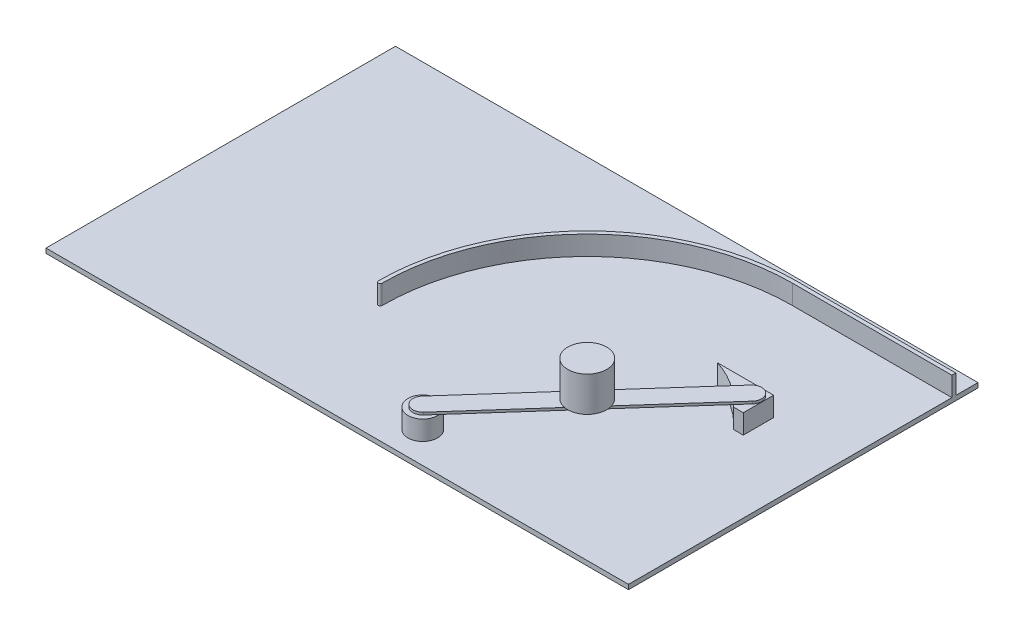
ISO-10303-21;
HEADER;
FILE_DESCRIPTION(('STEP AP214'),'2;1');
FILE_NAME('part.step','',(''),(''),'','','');
FILE_SCHEMA(('AUTOMOTIVE_DESIGN { 1 0 10303 214 1 1 1 1 }'));
ENDSEC;
DATA;
#1=APPLICATION_CONTEXT('core data for automotive mechanical design processes');
#2=APPLICATION_PROTOCOL_DEFINITION('international standard','automotive_design',2000,#1);
#3=PRODUCT_CONTEXT('',#1,'mechanical');
#4=PRODUCT('Part','Part','',(#3));
#5=PRODUCT_RELATED_PRODUCT_CATEGORY('part','',(#4));
#6=PRODUCT_DEFINITION_FORMATION('','',#4);
#7=PRODUCT_DEFINITION_CONTEXT('part definition',#1,'design');
#8=PRODUCT_DEFINITION('design','',#6,#7);
#9=PRODUCT_DEFINITION_SHAPE('','',#8);
#10=(LENGTH_UNIT() NAMED_UNIT(*) SI_UNIT(.MILLI.,.METRE.));
#11=(NAMED_UNIT(*) PLANE_ANGLE_UNIT() SI_UNIT($,.RADIAN.));
#12=(NAMED_UNIT(*) SI_UNIT($,.STERADIAN.) SOLID_ANGLE_UNIT());
#13=UNCERTAINTY_MEASURE_WITH_UNIT(LENGTH_MEASURE(1.E-05),#10,'distance_accuracy_value','');
#14=(GEOMETRIC_REPRESENTATION_CONTEXT(3) GLOBAL_UNCERTAINTY_ASSIGNED_CONTEXT((#13)) GLOBAL_UNIT_ASSIGNED_CONTEXT((#10,
#11,#12)) REPRESENTATION_CONTEXT('',''));
#15=CARTESIAN_POINT('',(0.,0.,0.));
#16=DIRECTION('',(0.,0.,1.));
#17=DIRECTION('',(1.,0.,0.));
#18=AXIS2_PLACEMENT_3D('',#15,#16,#17);
#19=CARTESIAN_POINT('',(139.585526399238,68.35,369.329131793552));
#20=DIRECTION('',(0.,1.,0.));
#21=DIRECTION('',(0.,0.,1.));
#22=AXIS2_PLACEMENT_3D('',#19,#20,#21);
#23=PLANE('',#22);
#24=CARTESIAN_POINT('',(339.,68.35,145.2));
#25=DIRECTION('',(0.,1.,0.));
#26=DIRECTION('',(0.,0.,1.));
#27=AXIS2_PLACEMENT_3D('',#24,#25,#26);
#28=CIRCLE('',#27,50.);
#29=CARTESIAN_POINT('',(386.604110901907,68.35,129.907890098521));
#30=VERTEX_POINT('',#29);
#31=CARTESIAN_POINT('',(348.651577918199,68.35,96.140372568792));
#32=VERTEX_POINT('',#31);
#33=EDGE_CURVE('E48',#30,#32,#28,.T.);
#34=ORIENTED_EDGE('',*,*,#33,.F.);
#35=DIRECTION('',(0.664714912002537,0.,-0.747097105978506));
#36=VECTOR('',#35,1.);
#37=CARTESIAN_POINT('',(158.561792891093,68.35,386.212890558416));
#38=LINE('',#37,#36);
#39=CARTESIAN_POINT('',(557.390740092615,68.35,-62.0453730286874));
#40=VERTEX_POINT('',#39);
#41=EDGE_CURVE('E198',#30,#40,#38,.T.);
#42=ORIENTED_EDGE('',*,*,#41,.T.);
#43=CARTESIAN_POINT('',(538.414473600761,68.35,-78.9291317935519));
#44=DIRECTION('',(0.,1.,0.));
#45=DIRECTION('',(0.,0.,1.));
#46=AXIS2_PLACEMENT_3D('',#43,#44,#45);
#47=CIRCLE('',#46,25.4);
#48=CARTESIAN_POINT('',(519.438207108907,68.35,-95.8128905584162));
#49=VERTEX_POINT('',#48);
#50=EDGE_CURVE('E195',#40,#49,#47,.T.);
#51=ORIENTED_EDGE('',*,*,#50,.T.);
#52=DIRECTION('',(-0.664714912002537,0.,0.747097105978506));
#53=VECTOR('',#52,1.);
#54=CARTESIAN_POINT('',(120.609259907385,68.35,352.445373028687));
#55=LINE('',#54,#53);
#56=EDGE_CURVE('E230',#49,#32,#55,.T.);
#57=ORIENTED_EDGE('',*,*,#56,.T.);
#58=EDGE_LOOP('',(#34,#42,#51,#57));
#59=FACE_BOUND('',#58,.T.);
#60=ADVANCED_FACE('F37',(#59),#23,.T.);
#61=CARTESIAN_POINT('',(339.,62.,145.2));
#62=DIRECTION('',(0.,-1.,0.));
#63=DIRECTION('',(0.,0.,-1.));
#64=AXIS2_PLACEMENT_3D('',#61,#62,#63);
#65=PLANE('',#64);
#66=DIRECTION('',(-0.664714912002537,0.,0.747097105978506));
#67=VECTOR('',#66,1.);
#68=CARTESIAN_POINT('',(120.609259907385,62.,352.445373028687));
#69=LINE('',#68,#67);
#70=CARTESIAN_POINT('',(519.438207108907,62.,-95.8128905584162));
#71=VERTEX_POINT('',#70);
#72=CARTESIAN_POINT('',(496.497380608194,62.,-70.0288667942978));
#73=VERTEX_POINT('',#72);
#74=EDGE_CURVE('E226',#71,#73,#69,.T.);
#75=ORIENTED_EDGE('',*,*,#74,.F.);
#76=CARTESIAN_POINT('',(538.414473600761,62.,-78.9291317935519));
#77=DIRECTION('',(0.,1.,0.));
#78=DIRECTION('',(0.,0.,1.));
#79=AXIS2_PLACEMENT_3D('',#76,#77,#78);
#80=CIRCLE('',#79,25.4);
#81=CARTESIAN_POINT('',(557.390740092615,62.,-62.0453730286874));
#82=VERTEX_POINT('',#81);
#83=EDGE_CURVE('E238',#82,#71,#80,.T.);
#84=ORIENTED_EDGE('',*,*,#83,.F.);
#85=DIRECTION('',(0.664714912002537,0.,-0.747097105978506));
#86=VECTOR('',#85,1.);
#87=CARTESIAN_POINT('',(158.561792891093,62.,386.212890558416));
#88=LINE('',#87,#86);
#89=CARTESIAN_POINT('',(534.449913591902,62.,-36.261349264569));
#90=VERTEX_POINT('',#89);
#91=EDGE_CURVE('E46',#90,#82,#88,.T.);
#92=ORIENTED_EDGE('',*,*,#91,.F.);
#93=CARTESIAN_POINT('',(339.,62.,145.2));
#94=DIRECTION('',(0.,-1.,0.));
#95=DIRECTION('',(0.,0.,-1.));
#96=AXIS2_PLACEMENT_3D('',#93,#94,#95);
#97=CIRCLE('',#96,266.7);
#98=CARTESIAN_POINT('',(539.591489322543,62.,-30.5610434975967));
#99=VERTEX_POINT('',#98);
#100=EDGE_CURVE('E261',#90,#99,#97,.T.);
#101=ORIENTED_EDGE('',*,*,#100,.T.);
#102=DIRECTION('',(1.,0.,0.));
#103=VECTOR('',#102,1.);
#104=CARTESIAN_POINT('',(564.991489322543,62.,-30.5610434975967));
#105=LINE('',#104,#103);
#106=CARTESIAN_POINT('',(564.991489322543,62.,-30.5610434975967));
#107=VERTEX_POINT('',#106);
#108=EDGE_CURVE('E259',#99,#107,#105,.T.);
#109=ORIENTED_EDGE('',*,*,#108,.T.);
#110=DIRECTION('',(0.,0.,-1.));
#111=VECTOR('',#110,1.);
#112=CARTESIAN_POINT('',(564.991489322543,62.,-108.8));
#113=LINE('',#112,#111);
#114=CARTESIAN_POINT('',(564.991489322543,62.,-108.8));
#115=VERTEX_POINT('',#114);
#116=EDGE_CURVE('E263',#107,#115,#113,.T.);
#117=ORIENTED_EDGE('',*,*,#116,.T.);
#118=DIRECTION('',(-1.,0.,0.));
#119=VECTOR('',#118,1.);
#120=CARTESIAN_POINT('',(564.991489322543,62.,-108.8));
#121=LINE('',#120,#119);
#122=CARTESIAN_POINT('',(420.319677815397,62.,-108.8));
#123=VERTEX_POINT('',#122);
#124=EDGE_CURVE('E265',#115,#123,#121,.T.);
#125=ORIENTED_EDGE('',*,*,#124,.T.);
#126=EDGE_CURVE('E256',#123,#73,#97,.T.);
#127=ORIENTED_EDGE('',*,*,#126,.T.);
#128=EDGE_LOOP('',(#75,#84,#92,#101,#109,#117,#125,#127));
#129=FACE_BOUND('',#128,.T.);
#130=ADVANCED_FACE('F370',(#129),#65,.F.);
#131=CARTESIAN_POINT('',(0.,12.,0.));
#132=DIRECTION('',(0.,1.,0.));
#133=DIRECTION('',(0.,0.,1.));
#134=AXIS2_PLACEMENT_3D('',#131,#132,#133);
#135=PLANE('',#134);
#136=CARTESIAN_POINT('',(139.585526399238,12.,369.329131793552));
#137=DIRECTION('',(0.,1.,0.));
#138=DIRECTION('',(0.,0.,1.));
#139=AXIS2_PLACEMENT_3D('',#136,#137,#138);
#140=CIRCLE('',#139,38.1);
#141=CARTESIAN_POINT('',(139.585526399238,12.,407.429131793552));
#142=VERTEX_POINT('',#141);
#143=EDGE_CURVE('E218',#142,#142,#140,.T.);
#144=ORIENTED_EDGE('',*,*,#143,.F.);
#145=EDGE_LOOP('',(#144));
#146=FACE_BOUND('',#145,.T.);
#147=DIRECTION('',(1.,0.,0.));
#148=VECTOR('',#147,1.);
#149=CARTESIAN_POINT('',(339.,12.,-382.8));
#150=LINE('',#149,#148);
#151=CARTESIAN_POINT('',(339.,12.,-382.8));
#152=VERTEX_POINT('',#151);
#153=CARTESIAN_POINT('',(750.,12.,-382.8));
#154=VERTEX_POINT('',#153);
#155=EDGE_CURVE('E286',#152,#154,#150,.T.);
#156=ORIENTED_EDGE('',*,*,#155,.F.);
#157=CARTESIAN_POINT('',(339.,12.,145.2));
#158=DIRECTION('',(0.,1.,0.));
#159=DIRECTION('',(0.,0.,1.));
#160=AXIS2_PLACEMENT_3D('',#157,#158,#159);
#161=CIRCLE('',#160,528.);
#162=CARTESIAN_POINT('',(-189.,12.,145.2));
#163=VERTEX_POINT('',#162);
#164=EDGE_CURVE('E290',#152,#163,#161,.T.);
#165=ORIENTED_EDGE('',*,*,#164,.T.);
#166=CARTESIAN_POINT('',(-194.,12.,145.2));
#167=DIRECTION('',(0.,-1.,0.));
#168=DIRECTION('',(0.,0.,-1.));
#169=AXIS2_PLACEMENT_3D('',#166,#167,#168);
#170=CIRCLE('',#169,5.);
#171=CARTESIAN_POINT('',(-199.,12.,145.2));
#172=VERTEX_POINT('',#171);
#173=EDGE_CURVE('E313',#163,#172,#170,.T.);
#174=ORIENTED_EDGE('',*,*,#173,.T.);
#175=CARTESIAN_POINT('',(339.,12.,145.2));
#176=DIRECTION('',(0.,1.,0.));
#177=DIRECTION('',(0.,0.,1.));
#178=AXIS2_PLACEMENT_3D('',#175,#176,#177);
#179=CIRCLE('',#178,538.);
#180=CARTESIAN_POINT('',(339.,12.,-392.8));
#181=VERTEX_POINT('',#180);
#182=EDGE_CURVE('E310',#181,#172,#179,.T.);
#183=ORIENTED_EDGE('',*,*,#182,.F.);
#184=DIRECTION('',(1.,0.,0.));
#185=VECTOR('',#184,1.);
#186=CARTESIAN_POINT('',(339.,12.,-392.8));
#187=LINE('',#186,#185);
#188=CARTESIAN_POINT('',(750.,12.,-392.8));
#189=VERTEX_POINT('',#188);
#190=EDGE_CURVE('E307',#181,#189,#187,.T.);
#191=ORIENTED_EDGE('',*,*,#190,.T.);
#192=DIRECTION('',(0.,0.,-1.));
#193=VECTOR('',#192,1.);
#194=CARTESIAN_POINT('',(750.,12.,450.));
#195=LINE('',#194,#193);
#196=CARTESIAN_POINT('',(750.,12.,-450.));
#197=VERTEX_POINT('',#196);
#198=EDGE_CURVE('E336',#189,#197,#195,.T.);
#199=ORIENTED_EDGE('',*,*,#198,.T.);
#200=DIRECTION('',(-1.,0.,0.));
#201=VECTOR('',#200,1.);
#202=CARTESIAN_POINT('',(750.,12.,-450.));
#203=LINE('',#202,#201);
#204=CARTESIAN_POINT('',(-750.,12.,-450.));
#205=VERTEX_POINT('',#204);
#206=EDGE_CURVE('E340',#197,#205,#203,.T.);
#207=ORIENTED_EDGE('',*,*,#206,.T.);
#208=DIRECTION('',(0.,0.,1.));
#209=VECTOR('',#208,1.);
#210=CARTESIAN_POINT('',(-750.,12.,450.));
#211=LINE('',#210,#209);
#212=CARTESIAN_POINT('',(-750.,12.,450.));
#213=VERTEX_POINT('',#212);
#214=EDGE_CURVE('E330',#205,#213,#211,.T.);
#215=ORIENTED_EDGE('',*,*,#214,.T.);
#216=DIRECTION('',(1.,0.,0.));
#217=VECTOR('',#216,1.);
#218=CARTESIAN_POINT('',(750.,12.,450.));
#219=LINE('',#218,#217);
#220=CARTESIAN_POINT('',(750.,12.,450.));
#221=VERTEX_POINT('',#220);
#222=EDGE_CURVE('E333',#213,#221,#219,.T.);
#223=ORIENTED_EDGE('',*,*,#222,.T.);
#224=EDGE_CURVE('E337',#221,#154,#195,.T.);
#225=ORIENTED_EDGE('',*,*,#224,.T.);
#226=EDGE_LOOP('',(#156,#165,#174,#183,#191,#199,#207,#215,#223,#225));
#227=FACE_BOUND('',#226,.T.);
#228=DIRECTION('',(1.,0.,0.));
#229=VECTOR('',#228,1.);
#230=CARTESIAN_POINT('',(564.991489322543,12.,-30.5610434975967));
#231=LINE('',#230,#229);
#232=CARTESIAN_POINT('',(539.591489322543,12.,-30.5610434975967));
#233=VERTEX_POINT('',#232);
#234=CARTESIAN_POINT('',(564.991489322543,12.,-30.5610434975967));
#235=VERTEX_POINT('',#234);
#236=EDGE_CURVE('E270',#233,#235,#231,.T.);
#237=ORIENTED_EDGE('',*,*,#236,.F.);
#238=CARTESIAN_POINT('',(339.,12.,145.2));
#239=DIRECTION('',(0.,-1.,0.));
#240=DIRECTION('',(0.,0.,-1.));
#241=AXIS2_PLACEMENT_3D('',#238,#239,#240);
#242=CIRCLE('',#241,266.7);
#243=CARTESIAN_POINT('',(420.319677815397,12.,-108.8));
#244=VERTEX_POINT('',#243);
#245=EDGE_CURVE('E255',#244,#233,#242,.T.);
#246=ORIENTED_EDGE('',*,*,#245,.F.);
#247=DIRECTION('',(-1.,0.,0.));
#248=VECTOR('',#247,1.);
#249=CARTESIAN_POINT('',(564.991489322543,12.,-108.8));
#250=LINE('',#249,#248);
#251=CARTESIAN_POINT('',(564.991489322543,12.,-108.8));
#252=VERTEX_POINT('',#251);
#253=EDGE_CURVE('E275',#252,#244,#250,.T.);
#254=ORIENTED_EDGE('',*,*,#253,.F.);
#255=DIRECTION('',(0.,0.,-1.));
#256=VECTOR('',#255,1.);
#257=CARTESIAN_POINT('',(564.991489322543,12.,-108.8));
#258=LINE('',#257,#256);
#259=EDGE_CURVE('E272',#235,#252,#258,.T.);
#260=ORIENTED_EDGE('',*,*,#259,.F.);
#261=EDGE_LOOP('',(#237,#246,#254,#260));
#262=FACE_BOUND('',#261,.T.);
#263=ADVANCED_FACE('F392',(#146,#227,#262),#135,.T.);
#264=CARTESIAN_POINT('',(-750.,12.,450.));
#265=DIRECTION('',(1.,0.,0.));
#266=DIRECTION('',(0.,0.,-1.));
#267=AXIS2_PLACEMENT_3D('',#264,#265,#266);
#268=PLANE('',#267);
#269=DIRECTION('',(0.,0.,1.));
#270=VECTOR('',#269,1.);
#271=CARTESIAN_POINT('',(-750.,0.,450.));
#272=LINE('',#271,#270);
#273=CARTESIAN_POINT('',(-750.,0.,-450.));
#274=VERTEX_POINT('',#273);
#275=CARTESIAN_POINT('',(-750.,0.,450.));
#276=VERTEX_POINT('',#275);
#277=EDGE_CURVE('E329',#274,#276,#272,.T.);
#278=ORIENTED_EDGE('',*,*,#277,.T.);
#279=DIRECTION('',(0.,-1.,0.));
#280=VECTOR('',#279,1.);
#281=CARTESIAN_POINT('',(-750.,12.,450.));
#282=LINE('',#281,#280);
#283=EDGE_CURVE('E41',#213,#276,#282,.T.);
#284=ORIENTED_EDGE('',*,*,#283,.F.);
#285=ORIENTED_EDGE('',*,*,#214,.F.);
#286=DIRECTION('',(0.,-1.,0.));
#287=VECTOR('',#286,1.);
#288=CARTESIAN_POINT('',(-750.,12.,-450.));
#289=LINE('',#288,#287);
#290=EDGE_CURVE('E342',#205,#274,#289,.T.);
#291=ORIENTED_EDGE('',*,*,#290,.T.);
#292=EDGE_LOOP('',(#278,#284,#285,#291));
#293=FACE_BOUND('',#292,.T.);
#294=ADVANCED_FACE('F39',(#293),#268,.F.);
#295=CARTESIAN_POINT('',(750.,12.,450.));
#296=DIRECTION('',(0.,0.,-1.));
#297=DIRECTION('',(-1.,0.,0.));
#298=AXIS2_PLACEMENT_3D('',#295,#296,#297);
#299=PLANE('',#298);
#300=DIRECTION('',(1.,0.,0.));
#301=VECTOR('',#300,1.);
#302=CARTESIAN_POINT('',(750.,0.,450.));
#303=LINE('',#302,#301);
#304=CARTESIAN_POINT('',(750.,0.,450.));
#305=VERTEX_POINT('',#304);
#306=EDGE_CURVE('E345',#276,#305,#303,.T.);
#307=ORIENTED_EDGE('',*,*,#306,.T.);
#308=DIRECTION('',(0.,-1.,0.));
#309=VECTOR('',#308,1.);
#310=CARTESIAN_POINT('',(750.,12.,450.));
#311=LINE('',#310,#309);
#312=EDGE_CURVE('E354',#221,#305,#311,.T.);
#313=ORIENTED_EDGE('',*,*,#312,.F.);
#314=ORIENTED_EDGE('',*,*,#222,.F.);
#315=ORIENTED_EDGE('',*,*,#283,.T.);
#316=EDGE_LOOP('',(#307,#313,#314,#315));
#317=FACE_BOUND('',#316,.T.);
#318=ADVANCED_FACE('F467',(#317),#299,.F.);
#319=CARTESIAN_POINT('',(750.,12.,450.));
#320=DIRECTION('',(-1.,0.,0.));
#321=DIRECTION('',(0.,0.,1.));
#322=AXIS2_PLACEMENT_3D('',#319,#320,#321);
#323=PLANE('',#322);
#324=DIRECTION('',(0.,0.,-1.));
#325=VECTOR('',#324,1.);
#326=CARTESIAN_POINT('',(750.,0.,450.));
#327=LINE('',#326,#325);
#328=CARTESIAN_POINT('',(750.,0.,-450.));
#329=VERTEX_POINT('',#328);
#330=EDGE_CURVE('E347',#305,#329,#327,.T.);
#331=ORIENTED_EDGE('',*,*,#330,.T.);
#332=DIRECTION('',(0.,-1.,0.));
#333=VECTOR('',#332,1.);
#334=CARTESIAN_POINT('',(750.,12.,-450.));
#335=LINE('',#334,#333);
#336=EDGE_CURVE('E352',#197,#329,#335,.T.);
#337=ORIENTED_EDGE('',*,*,#336,.F.);
#338=ORIENTED_EDGE('',*,*,#198,.F.);
#339=DIRECTION('',(0.,-1.,0.));
#340=VECTOR('',#339,1.);
#341=CARTESIAN_POINT('',(750.,62.,-392.8));
#342=LINE('',#341,#340);
#343=CARTESIAN_POINT('',(750.,62.,-392.8));
#344=VERTEX_POINT('',#343);
#345=EDGE_CURVE('E325',#344,#189,#342,.T.);
#346=ORIENTED_EDGE('',*,*,#345,.F.);
#347=DIRECTION('',(0.,0.,1.));
#348=VECTOR('',#347,1.);
#349=CARTESIAN_POINT('',(750.,62.,-392.8));
#350=LINE('',#349,#348);
#351=CARTESIAN_POINT('',(750.,62.,-382.8));
#352=VERTEX_POINT('',#351);
#353=EDGE_CURVE('E289',#344,#352,#350,.T.);
#354=ORIENTED_EDGE('',*,*,#353,.T.);
#355=DIRECTION('',(0.,-1.,0.));
#356=VECTOR('',#355,1.);
#357=CARTESIAN_POINT('',(750.,62.,-382.8));
#358=LINE('',#357,#356);
#359=EDGE_CURVE('E327',#352,#154,#358,.T.);
#360=ORIENTED_EDGE('',*,*,#359,.T.);
#361=ORIENTED_EDGE('',*,*,#224,.F.);
#362=ORIENTED_EDGE('',*,*,#312,.T.);
#363=EDGE_LOOP('',(#331,#337,#338,#346,#354,#360,#361,#362));
#364=FACE_BOUND('',#363,.T.);
#365=ADVANCED_FACE('F464',(#364),#323,.F.);
#366=CARTESIAN_POINT('',(750.,12.,-450.));
#367=DIRECTION('',(0.,0.,1.));
#368=DIRECTION('',(1.,0.,0.));
#369=AXIS2_PLACEMENT_3D('',#366,#367,#368);
#370=PLANE('',#369);
#371=DIRECTION('',(-1.,0.,0.));
#372=VECTOR('',#371,1.);
#373=CARTESIAN_POINT('',(750.,0.,-450.));
#374=LINE('',#373,#372);
#375=EDGE_CURVE('E334',#329,#274,#374,.T.);
#376=ORIENTED_EDGE('',*,*,#375,.T.);
#377=ORIENTED_EDGE('',*,*,#290,.F.);
#378=ORIENTED_EDGE('',*,*,#206,.F.);
#379=ORIENTED_EDGE('',*,*,#336,.T.);
#380=EDGE_LOOP('',(#376,#377,#378,#379));
#381=FACE_BOUND('',#380,.T.);
#382=ADVANCED_FACE('F460',(#381),#370,.F.);
#383=CARTESIAN_POINT('',(0.,0.,0.));
#384=DIRECTION('',(0.,1.,0.));
#385=DIRECTION('',(0.,0.,1.));
#386=AXIS2_PLACEMENT_3D('',#383,#384,#385);
#387=PLANE('',#386);
#388=ORIENTED_EDGE('',*,*,#277,.F.);
#389=ORIENTED_EDGE('',*,*,#375,.F.);
#390=ORIENTED_EDGE('',*,*,#330,.F.);
#391=ORIENTED_EDGE('',*,*,#306,.F.);
#392=EDGE_LOOP('',(#388,#389,#390,#391));
#393=FACE_BOUND('',#392,.T.);
#394=ADVANCED_FACE('F453',(#393),#387,.F.);
#395=CARTESIAN_POINT('',(339.,62.,-382.8));
#396=DIRECTION('',(0.,0.,-1.));
#397=DIRECTION('',(-1.,0.,0.));
#398=AXIS2_PLACEMENT_3D('',#395,#396,#397);
#399=PLANE('',#398);
#400=ORIENTED_EDGE('',*,*,#155,.T.);
#401=ORIENTED_EDGE('',*,*,#359,.F.);
#402=DIRECTION('',(1.,0.,0.));
#403=VECTOR('',#402,1.);
#404=CARTESIAN_POINT('',(339.,62.,-382.8));
#405=LINE('',#404,#403);
#406=CARTESIAN_POINT('',(339.,62.,-382.8));
#407=VERTEX_POINT('',#406);
#408=EDGE_CURVE('E287',#407,#352,#405,.T.);
#409=ORIENTED_EDGE('',*,*,#408,.F.);
#410=DIRECTION('',(0.,-1.,0.));
#411=VECTOR('',#410,1.);
#412=CARTESIAN_POINT('',(339.,62.,-382.8));
#413=LINE('',#412,#411);
#414=EDGE_CURVE('E304',#407,#152,#413,.T.);
#415=ORIENTED_EDGE('',*,*,#414,.T.);
#416=EDGE_LOOP('',(#400,#401,#409,#415));
#417=FACE_BOUND('',#416,.T.);
#418=ADVANCED_FACE('F449',(#417),#399,.F.);
#419=CARTESIAN_POINT('',(339.,62.,-392.8));
#420=DIRECTION('',(0.,0.,-1.));
#421=DIRECTION('',(-1.,0.,0.));
#422=AXIS2_PLACEMENT_3D('',#419,#420,#421);
#423=PLANE('',#422);
#424=ORIENTED_EDGE('',*,*,#190,.F.);
#425=DIRECTION('',(0.,-1.,0.));
#426=VECTOR('',#425,1.);
#427=CARTESIAN_POINT('',(339.,62.,-392.8));
#428=LINE('',#427,#426);
#429=CARTESIAN_POINT('',(339.,62.,-392.8));
#430=VERTEX_POINT('',#429);
#431=EDGE_CURVE('E323',#430,#181,#428,.T.);
#432=ORIENTED_EDGE('',*,*,#431,.F.);
#433=DIRECTION('',(1.,0.,0.));
#434=VECTOR('',#433,1.);
#435=CARTESIAN_POINT('',(339.,62.,-392.8));
#436=LINE('',#435,#434);
#437=EDGE_CURVE('E293',#430,#344,#436,.T.);
#438=ORIENTED_EDGE('',*,*,#437,.T.);
#439=ORIENTED_EDGE('',*,*,#345,.T.);
#440=EDGE_LOOP('',(#424,#432,#438,#439));
#441=FACE_BOUND('',#440,.T.);
#442=ADVANCED_FACE('F445',(#441),#423,.T.);
#443=CARTESIAN_POINT('',(339.,62.,145.2));
#444=DIRECTION('',(0.,-1.,0.));
#445=DIRECTION('',(0.,0.,-1.));
#446=AXIS2_PLACEMENT_3D('',#443,#444,#445);
#447=CYLINDRICAL_SURFACE('',#446,538.);
#448=ORIENTED_EDGE('',*,*,#182,.T.);
#449=DIRECTION('',(0.,-1.,0.));
#450=VECTOR('',#449,1.);
#451=CARTESIAN_POINT('',(-199.,62.,145.2));
#452=LINE('',#451,#450);
#453=CARTESIAN_POINT('',(-199.,62.,145.2));
#454=VERTEX_POINT('',#453);
#455=EDGE_CURVE('E321',#454,#172,#452,.T.);
#456=ORIENTED_EDGE('',*,*,#455,.F.);
#457=CARTESIAN_POINT('',(339.,62.,145.2));
#458=DIRECTION('',(0.,1.,0.));
#459=DIRECTION('',(0.,0.,1.));
#460=AXIS2_PLACEMENT_3D('',#457,#458,#459);
#461=CIRCLE('',#460,538.);
#462=EDGE_CURVE('E296',#430,#454,#461,.T.);
#463=ORIENTED_EDGE('',*,*,#462,.F.);
#464=ORIENTED_EDGE('',*,*,#431,.T.);
#465=EDGE_LOOP('',(#448,#456,#463,#464));
#466=FACE_BOUND('',#465,.T.);
#467=ADVANCED_FACE('F441',(#466),#447,.T.);
#468=CARTESIAN_POINT('',(-194.,62.,145.2));
#469=DIRECTION('',(0.,-1.,0.));
#470=DIRECTION('',(0.,0.,-1.));
#471=AXIS2_PLACEMENT_3D('',#468,#469,#470);
#472=CYLINDRICAL_SURFACE('',#471,5.);
#473=ORIENTED_EDGE('',*,*,#173,.F.);
#474=DIRECTION('',(0.,-1.,0.));
#475=VECTOR('',#474,1.);
#476=CARTESIAN_POINT('',(-189.,62.,145.2));
#477=LINE('',#476,#475);
#478=CARTESIAN_POINT('',(-189.,62.,145.2));
#479=VERTEX_POINT('',#478);
#480=EDGE_CURVE('E319',#479,#163,#477,.T.);
#481=ORIENTED_EDGE('',*,*,#480,.F.);
#482=CARTESIAN_POINT('',(-194.,62.,145.2));
#483=DIRECTION('',(0.,-1.,0.));
#484=DIRECTION('',(0.,0.,-1.));
#485=AXIS2_PLACEMENT_3D('',#482,#483,#484);
#486=CIRCLE('',#485,5.);
#487=EDGE_CURVE('E298',#479,#454,#486,.T.);
#488=ORIENTED_EDGE('',*,*,#487,.T.);
#489=ORIENTED_EDGE('',*,*,#455,.T.);
#490=EDGE_LOOP('',(#473,#481,#488,#489));
#491=FACE_BOUND('',#490,.T.);
#492=ADVANCED_FACE('F437',(#491),#472,.T.);
#493=CARTESIAN_POINT('',(339.,62.,145.2));
#494=DIRECTION('',(0.,-1.,0.));
#495=DIRECTION('',(0.,0.,-1.));
#496=AXIS2_PLACEMENT_3D('',#493,#494,#495);
#497=CYLINDRICAL_SURFACE('',#496,528.);
#498=ORIENTED_EDGE('',*,*,#164,.F.);
#499=ORIENTED_EDGE('',*,*,#414,.F.);
#500=CARTESIAN_POINT('',(339.,62.,145.2));
#501=DIRECTION('',(0.,1.,0.));
#502=DIRECTION('',(0.,0.,1.));
#503=AXIS2_PLACEMENT_3D('',#500,#501,#502);
#504=CIRCLE('',#503,528.);
#505=EDGE_CURVE('E301',#407,#479,#504,.T.);
#506=ORIENTED_EDGE('',*,*,#505,.T.);
#507=ORIENTED_EDGE('',*,*,#480,.T.);
#508=EDGE_LOOP('',(#498,#499,#506,#507));
#509=FACE_BOUND('',#508,.T.);
#510=ADVANCED_FACE('F433',(#509),#497,.F.);
#511=CARTESIAN_POINT('',(339.,62.,145.2));
#512=DIRECTION('',(0.,1.,0.));
#513=DIRECTION('',(0.,0.,1.));
#514=AXIS2_PLACEMENT_3D('',#511,#512,#513);
#515=PLANE('',#514);
#516=ORIENTED_EDGE('',*,*,#408,.T.);
#517=ORIENTED_EDGE('',*,*,#353,.F.);
#518=ORIENTED_EDGE('',*,*,#437,.F.);
#519=ORIENTED_EDGE('',*,*,#462,.T.);
#520=ORIENTED_EDGE('',*,*,#487,.F.);
#521=ORIENTED_EDGE('',*,*,#505,.F.);
#522=EDGE_LOOP('',(#516,#517,#518,#519,#520,#521));
#523=FACE_BOUND('',#522,.T.);
#524=ADVANCED_FACE('F430',(#523),#515,.T.);
#525=CARTESIAN_POINT('',(339.,62.,145.2));
#526=DIRECTION('',(0.,-1.,0.));
#527=DIRECTION('',(0.,0.,-1.));
#528=AXIS2_PLACEMENT_3D('',#525,#526,#527);
#529=CYLINDRICAL_SURFACE('',#528,266.7);
#530=ORIENTED_EDGE('',*,*,#245,.T.);
#531=DIRECTION('',(0.,-1.,0.));
#532=VECTOR('',#531,1.);
#533=CARTESIAN_POINT('',(539.591489322543,62.,-30.5610434975967));
#534=LINE('',#533,#532);
#535=EDGE_CURVE('E284',#99,#233,#534,.T.);
#536=ORIENTED_EDGE('',*,*,#535,.F.);
#537=ORIENTED_EDGE('',*,*,#100,.F.);
#538=EDGE_CURVE('E260',#73,#90,#97,.T.);
#539=ORIENTED_EDGE('',*,*,#538,.F.);
#540=ORIENTED_EDGE('',*,*,#126,.F.);
#541=DIRECTION('',(0.,-1.,0.));
#542=VECTOR('',#541,1.);
#543=CARTESIAN_POINT('',(420.319677815397,62.,-108.8));
#544=LINE('',#543,#542);
#545=EDGE_CURVE('E267',#123,#244,#544,.T.);
#546=ORIENTED_EDGE('',*,*,#545,.T.);
#547=EDGE_LOOP('',(#530,#536,#537,#539,#540,#546));
#548=FACE_BOUND('',#547,.T.);
#549=ADVANCED_FACE('F374',(#548),#529,.F.);
#550=CARTESIAN_POINT('',(564.991489322543,62.,-30.5610434975967));
#551=DIRECTION('',(0.,0.,-1.));
#552=DIRECTION('',(-1.,0.,0.));
#553=AXIS2_PLACEMENT_3D('',#550,#551,#552);
#554=PLANE('',#553);
#555=ORIENTED_EDGE('',*,*,#236,.T.);
#556=DIRECTION('',(0.,-1.,0.));
#557=VECTOR('',#556,1.);
#558=CARTESIAN_POINT('',(564.991489322543,62.,-30.5610434975967));
#559=LINE('',#558,#557);
#560=EDGE_CURVE('E281',#107,#235,#559,.T.);
#561=ORIENTED_EDGE('',*,*,#560,.F.);
#562=ORIENTED_EDGE('',*,*,#108,.F.);
#563=ORIENTED_EDGE('',*,*,#535,.T.);
#564=EDGE_LOOP('',(#555,#561,#562,#563));
#565=FACE_BOUND('',#564,.T.);
#566=ADVANCED_FACE('F423',(#565),#554,.F.);
#567=CARTESIAN_POINT('',(564.991489322543,62.,-108.8));
#568=DIRECTION('',(-1.,0.,0.));
#569=DIRECTION('',(0.,0.,1.));
#570=AXIS2_PLACEMENT_3D('',#567,#568,#569);
#571=PLANE('',#570);
#572=ORIENTED_EDGE('',*,*,#259,.T.);
#573=DIRECTION('',(0.,-1.,0.));
#574=VECTOR('',#573,1.);
#575=CARTESIAN_POINT('',(564.991489322543,62.,-108.8));
#576=LINE('',#575,#574);
#577=EDGE_CURVE('E279',#115,#252,#576,.T.);
#578=ORIENTED_EDGE('',*,*,#577,.F.);
#579=ORIENTED_EDGE('',*,*,#116,.F.);
#580=ORIENTED_EDGE('',*,*,#560,.T.);
#581=EDGE_LOOP('',(#572,#578,#579,#580));
#582=FACE_BOUND('',#581,.T.);
#583=ADVANCED_FACE('F419',(#582),#571,.F.);
#584=CARTESIAN_POINT('',(564.991489322543,62.,-108.8));
#585=DIRECTION('',(0.,0.,1.));
#586=DIRECTION('',(1.,0.,0.));
#587=AXIS2_PLACEMENT_3D('',#584,#585,#586);
#588=PLANE('',#587);
#589=ORIENTED_EDGE('',*,*,#253,.T.);
#590=ORIENTED_EDGE('',*,*,#545,.F.);
#591=ORIENTED_EDGE('',*,*,#124,.F.);
#592=ORIENTED_EDGE('',*,*,#577,.T.);
#593=EDGE_LOOP('',(#589,#590,#591,#592));
#594=FACE_BOUND('',#593,.T.);
#595=ADVANCED_FACE('F416',(#594),#588,.F.);
#596=CARTESIAN_POINT('',(139.585526399238,62.,369.329131793552));
#597=DIRECTION('',(0.,1.,0.));
#598=DIRECTION('',(0.,0.,1.));
#599=AXIS2_PLACEMENT_3D('',#596,#597,#598);
#600=PLANE('',#599);
#601=CARTESIAN_POINT('',(139.585526399238,62.,369.329131793552));
#602=DIRECTION('',(0.,1.,0.));
#603=DIRECTION('',(0.,0.,1.));
#604=AXIS2_PLACEMENT_3D('',#601,#602,#603);
#605=CIRCLE('',#604,38.1);
#606=CARTESIAN_POINT('',(177.438409048065,62.,364.996779640948));
#607=VERTEX_POINT('',#606);
#608=CARTESIAN_POINT('',(139.485876064358,62.,331.229262111219));
#609=VERTEX_POINT('',#608);
#610=EDGE_CURVE('E222',#607,#609,#605,.T.);
#611=ORIENTED_EDGE('',*,*,#610,.T.);
#612=EDGE_CURVE('E244',#73,#609,#69,.T.);
#613=ORIENTED_EDGE('',*,*,#612,.F.);
#614=ORIENTED_EDGE('',*,*,#538,.T.);
#615=EDGE_CURVE('E235',#607,#90,#88,.T.);
#616=ORIENTED_EDGE('',*,*,#615,.F.);
#617=EDGE_LOOP('',(#611,#613,#614,#616));
#618=FACE_BOUND('',#617,.T.);
#619=ADVANCED_FACE('F377',(#618),#600,.F.);
#620=CARTESIAN_POINT('',(139.585526399238,68.35,369.329131793552));
#621=DIRECTION('',(0.,-1.,0.));
#622=DIRECTION('',(0.,0.,-1.));
#623=AXIS2_PLACEMENT_3D('',#620,#621,#622);
#624=CYLINDRICAL_SURFACE('',#623,25.4);
#625=CARTESIAN_POINT('',(139.585526399238,62.,369.329131793552));
#626=DIRECTION('',(0.,1.,0.));
#627=DIRECTION('',(0.,0.,1.));
#628=AXIS2_PLACEMENT_3D('',#625,#626,#627);
#629=CIRCLE('',#628,25.4);
#630=CARTESIAN_POINT('',(120.609259907385,62.,352.445373028687));
#631=VERTEX_POINT('',#630);
#632=CARTESIAN_POINT('',(158.561792891093,62.,386.212890558416));
#633=VERTEX_POINT('',#632);
#634=EDGE_CURVE('E225',#631,#633,#629,.T.);
#635=ORIENTED_EDGE('',*,*,#634,.T.);
#636=DIRECTION('',(0.,-1.,0.));
#637=VECTOR('',#636,1.);
#638=CARTESIAN_POINT('',(158.561792891093,68.35,386.212890558416));
#639=LINE('',#638,#637);
#640=CARTESIAN_POINT('',(158.561792891093,68.35,386.212890558416));
#641=VERTEX_POINT('',#640);
#642=EDGE_CURVE('E253',#641,#633,#639,.T.);
#643=ORIENTED_EDGE('',*,*,#642,.F.);
#644=CARTESIAN_POINT('',(139.585526399238,68.35,369.329131793552));
#645=DIRECTION('',(0.,1.,0.));
#646=DIRECTION('',(0.,0.,1.));
#647=AXIS2_PLACEMENT_3D('',#644,#645,#646);
#648=CIRCLE('',#647,25.4);
#649=CARTESIAN_POINT('',(120.609259907385,68.35,352.445373028687));
#650=VERTEX_POINT('',#649);
#651=EDGE_CURVE('E191',#650,#641,#648,.T.);
#652=ORIENTED_EDGE('',*,*,#651,.F.);
#653=DIRECTION('',(0.,-1.,0.));
#654=VECTOR('',#653,1.);
#655=CARTESIAN_POINT('',(120.609259907385,68.35,352.445373028687));
#656=LINE('',#655,#654);
#657=EDGE_CURVE('E232',#650,#631,#656,.T.);
#658=ORIENTED_EDGE('',*,*,#657,.T.);
#659=EDGE_LOOP('',(#635,#643,#652,#658));
#660=FACE_BOUND('',#659,.T.);
#661=ADVANCED_FACE('F412',(#660),#624,.T.);
#662=CARTESIAN_POINT('',(158.561792891093,68.35,386.212890558416));
#663=DIRECTION('',(-0.747097105978506,0.,-0.664714912002537));
#664=DIRECTION('',(-0.664714912002537,0.,0.747097105978506));
#665=AXIS2_PLACEMENT_3D('',#662,#663,#664);
#666=PLANE('',#665);
#667=EDGE_CURVE('E236',#633,#607,#88,.T.);
#668=ORIENTED_EDGE('',*,*,#667,.T.);
#669=ORIENTED_EDGE('',*,*,#615,.T.);
#670=ORIENTED_EDGE('',*,*,#91,.T.);
#671=DIRECTION('',(0.,-1.,0.));
#672=VECTOR('',#671,1.);
#673=CARTESIAN_POINT('',(557.390740092615,68.35,-62.0453730286874));
#674=LINE('',#673,#672);
#675=EDGE_CURVE('E250',#40,#82,#674,.T.);
#676=ORIENTED_EDGE('',*,*,#675,.F.);
#677=ORIENTED_EDGE('',*,*,#41,.F.);
#678=CARTESIAN_POINT('',(329.348422081801,68.35,194.259627431208));
#679=VERTEX_POINT('',#678);
#680=EDGE_CURVE('E196',#679,#30,#38,.T.);
#681=ORIENTED_EDGE('',*,*,#680,.F.);
#682=EDGE_CURVE('E187',#641,#679,#38,.T.);
#683=ORIENTED_EDGE('',*,*,#682,.F.);
#684=ORIENTED_EDGE('',*,*,#642,.T.);
#685=EDGE_LOOP('',(#668,#669,#670,#676,#677,#681,#683,#684));
#686=FACE_BOUND('',#685,.T.);
#687=ADVANCED_FACE('F203',(#686),#666,.F.);
#688=CARTESIAN_POINT('',(538.414473600761,68.35,-78.9291317935519));
#689=DIRECTION('',(0.,-1.,0.));
#690=DIRECTION('',(0.,0.,-1.));
#691=AXIS2_PLACEMENT_3D('',#688,#689,#690);
#692=CYLINDRICAL_SURFACE('',#691,25.4);
#693=ORIENTED_EDGE('',*,*,#83,.T.);
#694=DIRECTION('',(0.,-1.,0.));
#695=VECTOR('',#694,1.);
#696=CARTESIAN_POINT('',(519.438207108907,68.35,-95.8128905584162));
#697=LINE('',#696,#695);
#698=EDGE_CURVE('E247',#49,#71,#697,.T.);
#699=ORIENTED_EDGE('',*,*,#698,.F.);
#700=ORIENTED_EDGE('',*,*,#50,.F.);
#701=ORIENTED_EDGE('',*,*,#675,.T.);
#702=EDGE_LOOP('',(#693,#699,#700,#701));
#703=FACE_BOUND('',#702,.T.);
#704=ADVANCED_FACE('F384',(#703),#692,.T.);
#705=CARTESIAN_POINT('',(120.609259907385,68.35,352.445373028687));
#706=DIRECTION('',(0.747097105978506,0.,0.664714912002537));
#707=DIRECTION('',(0.664714912002537,0.,-0.747097105978506));
#708=AXIS2_PLACEMENT_3D('',#705,#706,#707);
#709=PLANE('',#708);
#710=ORIENTED_EDGE('',*,*,#74,.T.);
#711=ORIENTED_EDGE('',*,*,#612,.T.);
#712=EDGE_CURVE('E241',#609,#631,#69,.T.);
#713=ORIENTED_EDGE('',*,*,#712,.T.);
#714=ORIENTED_EDGE('',*,*,#657,.F.);
#715=CARTESIAN_POINT('',(291.395889098093,68.35,160.492109901479));
#716=VERTEX_POINT('',#715);
#717=EDGE_CURVE('E229',#716,#650,#55,.T.);
#718=ORIENTED_EDGE('',*,*,#717,.F.);
#719=EDGE_CURVE('E61',#32,#716,#55,.T.);
#720=ORIENTED_EDGE('',*,*,#719,.F.);
#721=ORIENTED_EDGE('',*,*,#56,.F.);
#722=ORIENTED_EDGE('',*,*,#698,.T.);
#723=EDGE_LOOP('',(#710,#711,#713,#714,#718,#720,#721,#722));
#724=FACE_BOUND('',#723,.T.);
#725=ADVANCED_FACE('F381',(#724),#709,.F.);
#726=EDGE_CURVE('E11',#716,#679,#28,.T.);
#727=ORIENTED_EDGE('',*,*,#726,.F.);
#728=ORIENTED_EDGE('',*,*,#717,.T.);
#729=ORIENTED_EDGE('',*,*,#651,.T.);
#730=ORIENTED_EDGE('',*,*,#682,.T.);
#731=EDGE_LOOP('',(#727,#728,#729,#730));
#732=FACE_BOUND('',#731,.T.);
#733=ADVANCED_FACE('F189',(#732),#23,.T.);
#734=CARTESIAN_POINT('',(139.585526399238,62.,369.329131793552));
#735=DIRECTION('',(0.,1.,0.));
#736=DIRECTION('',(0.,0.,1.));
#737=AXIS2_PLACEMENT_3D('',#734,#735,#736);
#738=PLANE('',#737);
#739=ORIENTED_EDGE('',*,*,#667,.F.);
#740=ORIENTED_EDGE('',*,*,#634,.F.);
#741=ORIENTED_EDGE('',*,*,#712,.F.);
#742=EDGE_CURVE('E221',#609,#607,#605,.T.);
#743=ORIENTED_EDGE('',*,*,#742,.T.);
#744=EDGE_LOOP('',(#739,#740,#741,#743));
#745=FACE_BOUND('',#744,.T.);
#746=ADVANCED_FACE('F397',(#745),#738,.T.);
#747=CARTESIAN_POINT('',(139.585526399238,169.76307345283,369.329131793552));
#748=DIRECTION('',(0.,-1.,0.));
#749=DIRECTION('',(0.,0.,-1.));
#750=AXIS2_PLACEMENT_3D('',#747,#748,#749);
#751=CYLINDRICAL_SURFACE('',#750,38.1);
#752=ORIENTED_EDGE('',*,*,#143,.T.);
#753=EDGE_LOOP('',(#752));
#754=FACE_BOUND('',#753,.T.);
#755=ORIENTED_EDGE('',*,*,#610,.F.);
#756=ORIENTED_EDGE('',*,*,#742,.F.);
#757=EDGE_LOOP('',(#755,#756));
#758=FACE_BOUND('',#757,.T.);
#759=ADVANCED_FACE('F402',(#754,#758),#751,.T.);
#760=CARTESIAN_POINT('',(339.,68.35,145.2));
#761=DIRECTION('',(0.,1.,0.));
#762=DIRECTION('',(0.,0.,1.));
#763=AXIS2_PLACEMENT_3D('',#760,#761,#762);
#764=PLANE('',#763);
#765=EDGE_CURVE('E207',#679,#30,#28,.T.);
#766=ORIENTED_EDGE('',*,*,#765,.F.);
#767=ORIENTED_EDGE('',*,*,#680,.T.);
#768=EDGE_LOOP('',(#766,#767));
#769=FACE_BOUND('',#768,.T.);
#770=ADVANCED_FACE('F208',(#769),#764,.F.);
#771=EDGE_CURVE('E49',#32,#716,#28,.T.);
#772=ORIENTED_EDGE('',*,*,#771,.F.);
#773=ORIENTED_EDGE('',*,*,#719,.T.);
#774=EDGE_LOOP('',(#772,#773));
#775=FACE_BOUND('',#774,.T.);
#776=ADVANCED_FACE('F709',(#775),#764,.F.);
#777=CARTESIAN_POINT('',(339.,158.35,145.2));
#778=DIRECTION('',(0.,-1.,0.));
#779=DIRECTION('',(0.,0.,-1.));
#780=AXIS2_PLACEMENT_3D('',#777,#778,#779);
#781=CYLINDRICAL_SURFACE('',#780,50.);
#782=CARTESIAN_POINT('',(339.,158.35,145.2));
#783=DIRECTION('',(0.,1.,0.));
#784=DIRECTION('',(0.,0.,1.));
#785=AXIS2_PLACEMENT_3D('',#782,#783,#784);
#786=CIRCLE('',#785,50.);
#787=CARTESIAN_POINT('',(339.,158.35,195.2));
#788=VERTEX_POINT('',#787);
#789=EDGE_CURVE('E215',#788,#788,#786,.T.);
#790=ORIENTED_EDGE('',*,*,#789,.F.);
#791=EDGE_LOOP('',(#790));
#792=FACE_BOUND('',#791,.T.);
#793=ORIENTED_EDGE('',*,*,#33,.T.);
#794=ORIENTED_EDGE('',*,*,#771,.T.);
#795=ORIENTED_EDGE('',*,*,#726,.T.);
#796=ORIENTED_EDGE('',*,*,#765,.T.);
#797=EDGE_LOOP('',(#793,#794,#795,#796));
#798=FACE_BOUND('',#797,.T.);
#799=ADVANCED_FACE('F212',(#792,#798),#781,.T.);
#800=CARTESIAN_POINT('',(339.,158.35,145.2));
#801=DIRECTION('',(0.,1.,0.));
#802=DIRECTION('',(0.,0.,1.));
#803=AXIS2_PLACEMENT_3D('',#800,#801,#802);
#804=PLANE('',#803);
#805=ORIENTED_EDGE('',*,*,#789,.T.);
#806=EDGE_LOOP('',(#805));
#807=FACE_BOUND('',#806,.T.);
#808=ADVANCED_FACE('F725',(#807),#804,.T.);
#809=CLOSED_SHELL('',(#60,#130,#263,#294,#318,#365,#382,#394,#418,#442,#467,#492,#510,#524,#549,
#566,#583,#595,#619,#661,#687,#704,#725,#733,#746,#759,#770,#776,#799,#808));
#810=MANIFOLD_SOLID_BREP('B2',#809);
#811=ADVANCED_BREP_SHAPE_REPRESENTATION('',(#18,#810),#14);
#812=SHAPE_DEFINITION_REPRESENTATION(#9,#811);
ENDSEC;
END-ISO-10303-21;
